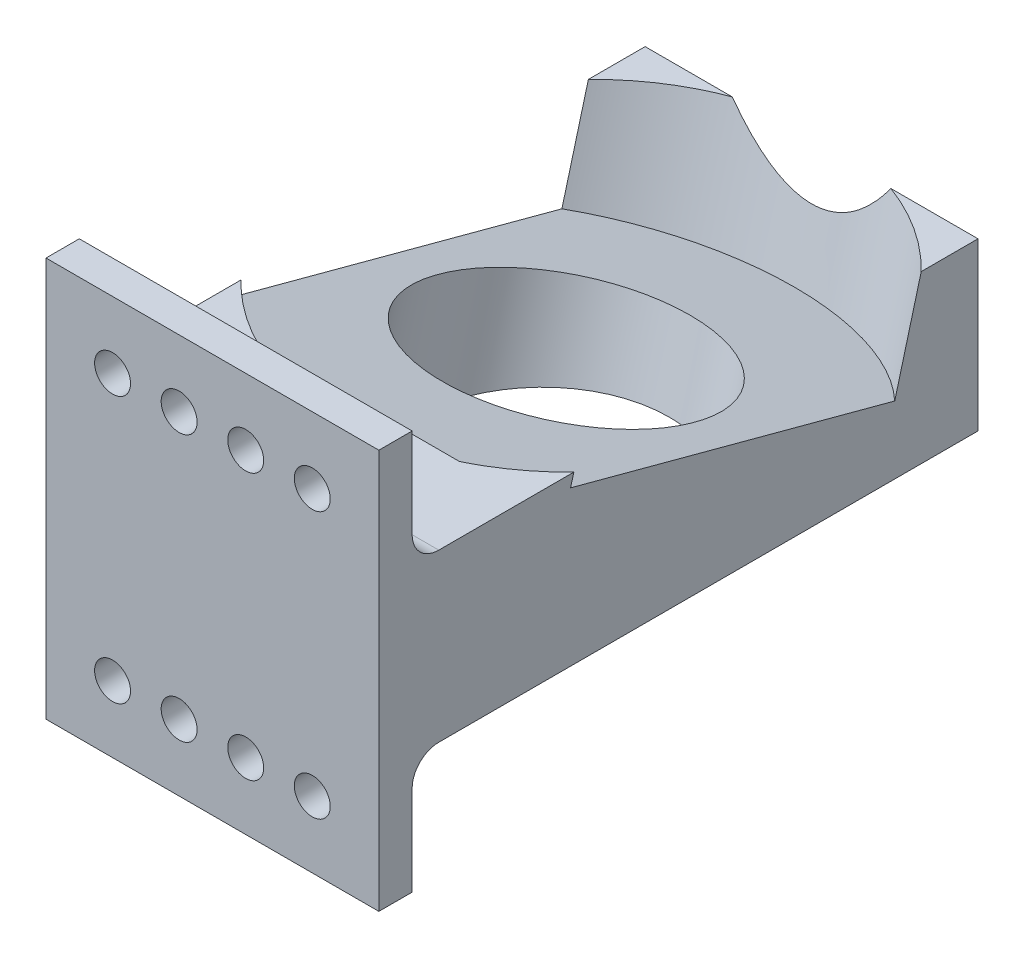
ISO-10303-21;
HEADER;
FILE_DESCRIPTION(('STEP AP214'),'2;1');
FILE_NAME('part.step','',(''),(''),'','','');
FILE_SCHEMA(('AUTOMOTIVE_DESIGN { 1 0 10303 214 1 1 1 1 }'));
ENDSEC;
DATA;
#1=APPLICATION_CONTEXT('core data for automotive mechanical design processes');
#2=APPLICATION_PROTOCOL_DEFINITION('international standard','automotive_design',2000,#1);
#3=PRODUCT_CONTEXT('',#1,'mechanical');
#4=PRODUCT('Part','Part','',(#3));
#5=PRODUCT_RELATED_PRODUCT_CATEGORY('part','',(#4));
#6=PRODUCT_DEFINITION_FORMATION('','',#4);
#7=PRODUCT_DEFINITION_CONTEXT('part definition',#1,'design');
#8=PRODUCT_DEFINITION('design','',#6,#7);
#9=PRODUCT_DEFINITION_SHAPE('','',#8);
#10=(LENGTH_UNIT() NAMED_UNIT(*) SI_UNIT(.MILLI.,.METRE.));
#11=(NAMED_UNIT(*) PLANE_ANGLE_UNIT() SI_UNIT($,.RADIAN.));
#12=(NAMED_UNIT(*) SI_UNIT($,.STERADIAN.) SOLID_ANGLE_UNIT());
#13=UNCERTAINTY_MEASURE_WITH_UNIT(LENGTH_MEASURE(1.E-05),#10,'distance_accuracy_value','');
#14=(GEOMETRIC_REPRESENTATION_CONTEXT(3) GLOBAL_UNCERTAINTY_ASSIGNED_CONTEXT((#13)) GLOBAL_UNIT_ASSIGNED_CONTEXT((#10,
#11,#12)) REPRESENTATION_CONTEXT('',''));
#15=CARTESIAN_POINT('',(0.,0.,0.));
#16=DIRECTION('',(0.,0.,1.));
#17=DIRECTION('',(1.,0.,0.));
#18=AXIS2_PLACEMENT_3D('',#15,#16,#17);
#19=CARTESIAN_POINT('',(31.75,15.875,-53.975));
#20=DIRECTION('',(0.,-1.,0.));
#21=DIRECTION('',(0.,0.,-1.));
#22=AXIS2_PLACEMENT_3D('',#19,#20,#21);
#23=PLANE('',#22);
#24=DIRECTION('',(0.,0.,1.));
#25=VECTOR('',#24,1.);
#26=CARTESIAN_POINT('',(-31.75,15.875,-53.975));
#27=LINE('',#26,#25);
#28=CARTESIAN_POINT('',(-31.75,15.875,-53.975));
#29=VERTEX_POINT('',#28);
#30=CARTESIAN_POINT('',(-31.75,15.875,-43.143798365032));
#31=VERTEX_POINT('',#30);
#32=EDGE_CURVE('E221',#29,#31,#27,.T.);
#33=ORIENTED_EDGE('',*,*,#32,.T.);
#34=CARTESIAN_POINT('',(0.,15.875,-10.0053416035631));
#35=DIRECTION('',(0.,-1.,0.));
#36=DIRECTION('',(0.,0.,1.));
#37=AXIS2_PLACEMENT_3D('',#34,#35,#36);
#38=ELLIPSE('',#37,46.6754265937885,45.085);
#39=CARTESIAN_POINT('',(-15.12729242551,15.875,-53.975));
#40=VERTEX_POINT('',#39);
#41=EDGE_CURVE('E206',#31,#40,#38,.T.);
#42=ORIENTED_EDGE('',*,*,#41,.T.);
#43=DIRECTION('',(-1.,0.,0.));
#44=VECTOR('',#43,1.);
#45=CARTESIAN_POINT('',(31.75,15.875,-53.975));
#46=LINE('',#45,#44);
#47=EDGE_CURVE('E226',#40,#29,#46,.T.);
#48=ORIENTED_EDGE('',*,*,#47,.T.);
#49=EDGE_LOOP('',(#33,#42,#48));
#50=FACE_BOUND('',#49,.T.);
#51=ADVANCED_FACE('F45',(#50),#23,.F.);
#52=CARTESIAN_POINT('',(31.75,15.875,-53.975));
#53=VERTEX_POINT('',#52);
#54=CARTESIAN_POINT('',(15.12729242551,15.875,-53.975));
#55=VERTEX_POINT('',#54);
#56=EDGE_CURVE('E236',#53,#55,#46,.T.);
#57=ORIENTED_EDGE('',*,*,#56,.T.);
#58=CARTESIAN_POINT('',(31.75,15.875,-43.143798365032));
#59=VERTEX_POINT('',#58);
#60=EDGE_CURVE('E211',#55,#59,#38,.T.);
#61=ORIENTED_EDGE('',*,*,#60,.T.);
#62=DIRECTION('',(0.,0.,1.));
#63=VECTOR('',#62,1.);
#64=CARTESIAN_POINT('',(31.75,15.875,-53.975));
#65=LINE('',#64,#63);
#66=EDGE_CURVE('E224',#53,#59,#65,.T.);
#67=ORIENTED_EDGE('',*,*,#66,.F.);
#68=EDGE_LOOP('',(#57,#61,#67));
#69=FACE_BOUND('',#68,.T.);
#70=ADVANCED_FACE('F314',(#69),#23,.F.);
#71=CARTESIAN_POINT('',(31.75,-15.875,-53.975));
#72=DIRECTION('',(0.,1.,0.));
#73=DIRECTION('',(0.,0.,1.));
#74=AXIS2_PLACEMENT_3D('',#71,#72,#73);
#75=PLANE('',#74);
#76=CARTESIAN_POINT('',(0.,-15.875,-1.49795474387514));
#77=DIRECTION('',(0.,1.,0.));
#78=DIRECTION('',(0.,0.,1.));
#79=AXIS2_PLACEMENT_3D('',#76,#77,#78);
#80=ELLIPSE('',#79,25.3099144205755,24.4475);
#81=CARTESIAN_POINT('',(0.,-15.875,23.8119596767003));
#82=VERTEX_POINT('',#81);
#83=EDGE_CURVE('E230',#82,#82,#80,.T.);
#84=ORIENTED_EDGE('',*,*,#83,.T.);
#85=EDGE_LOOP('',(#84));
#86=FACE_BOUND('',#85,.T.);
#87=DIRECTION('',(0.,0.,-1.));
#88=VECTOR('',#87,1.);
#89=CARTESIAN_POINT('',(31.75,-15.875,-53.975));
#90=LINE('',#89,#88);
#91=CARTESIAN_POINT('',(31.75,-15.875,48.895));
#92=VERTEX_POINT('',#91);
#93=CARTESIAN_POINT('',(31.75,-15.875,-53.975));
#94=VERTEX_POINT('',#93);
#95=EDGE_CURVE('E218',#92,#94,#90,.T.);
#96=ORIENTED_EDGE('',*,*,#95,.F.);
#97=DIRECTION('',(-1.,0.,0.));
#98=VECTOR('',#97,1.);
#99=CARTESIAN_POINT('',(31.75,-15.875,48.895));
#100=LINE('',#99,#98);
#101=CARTESIAN_POINT('',(-31.75,-15.875,48.895));
#102=VERTEX_POINT('',#101);
#103=EDGE_CURVE('E256',#92,#102,#100,.T.);
#104=ORIENTED_EDGE('',*,*,#103,.T.);
#105=DIRECTION('',(0.,0.,-1.));
#106=VECTOR('',#105,1.);
#107=CARTESIAN_POINT('',(-31.75,-15.875,-53.975));
#108=LINE('',#107,#106);
#109=CARTESIAN_POINT('',(-31.75,-15.875,-53.975));
#110=VERTEX_POINT('',#109);
#111=EDGE_CURVE('E227',#102,#110,#108,.T.);
#112=ORIENTED_EDGE('',*,*,#111,.T.);
#113=DIRECTION('',(-1.,0.,0.));
#114=VECTOR('',#113,1.);
#115=CARTESIAN_POINT('',(31.75,-15.875,-53.975));
#116=LINE('',#115,#114);
#117=EDGE_CURVE('E239',#94,#110,#116,.T.);
#118=ORIENTED_EDGE('',*,*,#117,.F.);
#119=EDGE_LOOP('',(#96,#104,#112,#118));
#120=FACE_BOUND('',#119,.T.);
#121=ADVANCED_FACE('F316',(#86,#120),#75,.F.);
#122=CARTESIAN_POINT('',(31.75,15.875,-53.975));
#123=DIRECTION('',(0.,0.,1.));
#124=DIRECTION('',(0.,-1.,0.));
#125=AXIS2_PLACEMENT_3D('',#122,#123,#124);
#126=PLANE('',#125);
#127=ORIENTED_EDGE('',*,*,#47,.F.);
#128=CARTESIAN_POINT('',(0.,179.971999126954,-53.9749999999999));
#129=DIRECTION('',(0.,0.,1.));
#130=DIRECTION('',(0.,-1.,0.));
#131=AXIS2_PLACEMENT_3D('',#128,#129,#130);
#132=ELLIPSE('',#131,174.195063512975,45.085);
#133=EDGE_CURVE('E208',#40,#55,#132,.T.);
#134=ORIENTED_EDGE('',*,*,#133,.T.);
#135=ORIENTED_EDGE('',*,*,#56,.F.);
#136=DIRECTION('',(0.,1.,0.));
#137=VECTOR('',#136,1.);
#138=CARTESIAN_POINT('',(31.75,15.875,-53.975));
#139=LINE('',#138,#137);
#140=EDGE_CURVE('E220',#94,#53,#139,.T.);
#141=ORIENTED_EDGE('',*,*,#140,.F.);
#142=ORIENTED_EDGE('',*,*,#117,.T.);
#143=DIRECTION('',(0.,1.,0.));
#144=VECTOR('',#143,1.);
#145=CARTESIAN_POINT('',(-31.75,15.875,-53.975));
#146=LINE('',#145,#144);
#147=EDGE_CURVE('E229',#110,#29,#146,.T.);
#148=ORIENTED_EDGE('',*,*,#147,.T.);
#149=EDGE_LOOP('',(#127,#134,#135,#141,#142,#148));
#150=FACE_BOUND('',#149,.T.);
#151=ADVANCED_FACE('F308',(#150),#126,.F.);
#152=CARTESIAN_POINT('',(-31.75,15.875,23.1331151579059));
#153=VERTEX_POINT('',#152);
#154=CARTESIAN_POINT('',(-31.75,15.875,48.895));
#155=VERTEX_POINT('',#154);
#156=EDGE_CURVE('E233',#153,#155,#27,.T.);
#157=ORIENTED_EDGE('',*,*,#156,.T.);
#158=DIRECTION('',(-1.,0.,0.));
#159=VECTOR('',#158,1.);
#160=CARTESIAN_POINT('',(31.75,15.875,48.895));
#161=LINE('',#160,#159);
#162=CARTESIAN_POINT('',(31.75,15.875,48.895));
#163=VERTEX_POINT('',#162);
#164=EDGE_CURVE('E254',#155,#163,#161,.F.);
#165=ORIENTED_EDGE('',*,*,#164,.T.);
#166=CARTESIAN_POINT('',(31.75,15.875,23.1331151579059));
#167=VERTEX_POINT('',#166);
#168=EDGE_CURVE('E223',#167,#163,#65,.T.);
#169=ORIENTED_EDGE('',*,*,#168,.F.);
#170=CARTESIAN_POINT('',(19.0851798134345,15.875,32.2817700293526));
#171=VERTEX_POINT('',#170);
#172=EDGE_CURVE('E207',#167,#171,#38,.T.);
#173=ORIENTED_EDGE('',*,*,#172,.T.);
#174=DIRECTION('',(-1.,0.,0.));
#175=VECTOR('',#174,1.);
#176=CARTESIAN_POINT('',(31.75,15.875,32.2817700293526));
#177=LINE('',#176,#175);
#178=CARTESIAN_POINT('',(-19.0851798134345,15.875,32.2817700293526));
#179=VERTEX_POINT('',#178);
#180=EDGE_CURVE('E200',#171,#179,#177,.T.);
#181=ORIENTED_EDGE('',*,*,#180,.T.);
#182=EDGE_CURVE('E203',#179,#153,#38,.T.);
#183=ORIENTED_EDGE('',*,*,#182,.T.);
#184=EDGE_LOOP('',(#157,#165,#169,#173,#181,#183));
#185=FACE_BOUND('',#184,.T.);
#186=ADVANCED_FACE('F286',(#185),#23,.F.);
#187=CARTESIAN_POINT('',(31.75,0.,0.));
#188=DIRECTION('',(-1.,0.,0.));
#189=DIRECTION('',(0.,0.,1.));
#190=AXIS2_PLACEMENT_3D('',#187,#188,#189);
#191=PLANE('',#190);
#192=ORIENTED_EDGE('',*,*,#66,.T.);
#193=DIRECTION('',(0.,-0.96592582628907,0.258819045102514));
#194=VECTOR('',#193,1.);
#195=CARTESIAN_POINT('',(31.75,-29.750057401948,-30.9186010795568));
#196=LINE('',#195,#194);
#197=CARTESIAN_POINT('',(31.75,-2.98139209859573,-38.0912433300489));
#198=VERTEX_POINT('',#197);
#199=EDGE_CURVE('E212',#59,#198,#196,.T.);
#200=ORIENTED_EDGE('',*,*,#199,.T.);
#201=DIRECTION('',(0.,0.258819045102514,0.96592582628907));
#202=VECTOR('',#201,1.);
#203=CARTESIAN_POINT('',(31.75,6.74113413520106,-1.80628144759695));
#204=LINE('',#203,#202);
#205=CARTESIAN_POINT('',(31.75,13.5878362821384,23.7459588290647));
#206=VERTEX_POINT('',#205);
#207=EDGE_CURVE('E197',#198,#206,#204,.T.);
#208=ORIENTED_EDGE('',*,*,#207,.T.);
#209=DIRECTION('',(0.,-0.96592582628907,0.258819045102514));
#210=VECTOR('',#209,1.);
#211=CARTESIAN_POINT('',(31.75,-13.1808290212139,30.9186010795567));
#212=LINE('',#211,#210);
#213=EDGE_CURVE('E215',#206,#167,#212,.F.);
#214=ORIENTED_EDGE('',*,*,#213,.T.);
#215=ORIENTED_EDGE('',*,*,#168,.T.);
#216=CARTESIAN_POINT('',(31.75,20.955,48.895));
#217=DIRECTION('',(-1.,0.,0.));
#218=DIRECTION('',(0.,0.,1.));
#219=AXIS2_PLACEMENT_3D('',#216,#217,#218);
#220=CIRCLE('',#219,5.08);
#221=CARTESIAN_POINT('',(31.75,20.955,53.975));
#222=VERTEX_POINT('',#221);
#223=EDGE_CURVE('E262',#163,#222,#220,.T.);
#224=ORIENTED_EDGE('',*,*,#223,.T.);
#225=DIRECTION('',(0.,1.,0.));
#226=VECTOR('',#225,1.);
#227=CARTESIAN_POINT('',(31.75,-38.1,53.975));
#228=LINE('',#227,#226);
#229=CARTESIAN_POINT('',(31.75,38.1,53.975));
#230=VERTEX_POINT('',#229);
#231=EDGE_CURVE('E182',#222,#230,#228,.T.);
#232=ORIENTED_EDGE('',*,*,#231,.T.);
#233=DIRECTION('',(0.,0.,-1.));
#234=VECTOR('',#233,1.);
#235=CARTESIAN_POINT('',(31.75,38.1,60.325));
#236=LINE('',#235,#234);
#237=CARTESIAN_POINT('',(31.75,38.1,60.325));
#238=VERTEX_POINT('',#237);
#239=EDGE_CURVE('E161',#238,#230,#236,.T.);
#240=ORIENTED_EDGE('',*,*,#239,.F.);
#241=DIRECTION('',(0.,1.,0.));
#242=VECTOR('',#241,1.);
#243=CARTESIAN_POINT('',(31.75,-38.1,60.325));
#244=LINE('',#243,#242);
#245=CARTESIAN_POINT('',(31.75,-38.1,60.325));
#246=VERTEX_POINT('',#245);
#247=EDGE_CURVE('E167',#246,#238,#244,.T.);
#248=ORIENTED_EDGE('',*,*,#247,.F.);
#249=DIRECTION('',(0.,0.,-1.));
#250=VECTOR('',#249,1.);
#251=CARTESIAN_POINT('',(31.75,-38.1,60.325));
#252=LINE('',#251,#250);
#253=CARTESIAN_POINT('',(31.75,-38.1,53.975));
#254=VERTEX_POINT('',#253);
#255=EDGE_CURVE('E583',#246,#254,#252,.T.);
#256=ORIENTED_EDGE('',*,*,#255,.T.);
#257=CARTESIAN_POINT('',(31.75,-20.955,53.975));
#258=VERTEX_POINT('',#257);
#259=EDGE_CURVE('E275',#254,#258,#228,.T.);
#260=ORIENTED_EDGE('',*,*,#259,.T.);
#261=CARTESIAN_POINT('',(31.75,-20.955,48.895));
#262=DIRECTION('',(-1.,0.,0.));
#263=DIRECTION('',(0.,0.,1.));
#264=AXIS2_PLACEMENT_3D('',#261,#262,#263);
#265=CIRCLE('',#264,5.08);
#266=EDGE_CURVE('E13',#258,#92,#265,.T.);
#267=ORIENTED_EDGE('',*,*,#266,.T.);
#268=ORIENTED_EDGE('',*,*,#95,.T.);
#269=ORIENTED_EDGE('',*,*,#140,.T.);
#270=EDGE_LOOP('',(#192,#200,#208,#214,#215,#224,#232,#240,#248,#256,#260,#267,#268,#269));
#271=FACE_BOUND('',#270,.T.);
#272=ADVANCED_FACE('F180',(#271),#191,.F.);
#273=CARTESIAN_POINT('',(-31.75,0.,0.));
#274=DIRECTION('',(-1.,0.,0.));
#275=DIRECTION('',(0.,0.,1.));
#276=AXIS2_PLACEMENT_3D('',#273,#274,#275);
#277=PLANE('',#276);
#278=DIRECTION('',(0.,-0.96592582628907,0.258819045102514));
#279=VECTOR('',#278,1.);
#280=CARTESIAN_POINT('',(-31.75,-29.750057401948,-30.9186010795568));
#281=LINE('',#280,#279);
#282=CARTESIAN_POINT('',(-31.75,-2.98139209859573,-38.0912433300489));
#283=VERTEX_POINT('',#282);
#284=EDGE_CURVE('E246',#31,#283,#281,.T.);
#285=ORIENTED_EDGE('',*,*,#284,.F.);
#286=ORIENTED_EDGE('',*,*,#32,.F.);
#287=ORIENTED_EDGE('',*,*,#147,.F.);
#288=ORIENTED_EDGE('',*,*,#111,.F.);
#289=CARTESIAN_POINT('',(-31.75,-20.955,48.895));
#290=DIRECTION('',(-1.,0.,0.));
#291=DIRECTION('',(0.,0.,1.));
#292=AXIS2_PLACEMENT_3D('',#289,#290,#291);
#293=CIRCLE('',#292,5.08);
#294=CARTESIAN_POINT('',(-31.75,-20.955,53.975));
#295=VERTEX_POINT('',#294);
#296=EDGE_CURVE('E53',#102,#295,#293,.F.);
#297=ORIENTED_EDGE('',*,*,#296,.T.);
#298=DIRECTION('',(0.,-1.,0.));
#299=VECTOR('',#298,1.);
#300=CARTESIAN_POINT('',(-31.75,-38.1,53.975));
#301=LINE('',#300,#299);
#302=CARTESIAN_POINT('',(-31.75,-38.1,53.975));
#303=VERTEX_POINT('',#302);
#304=EDGE_CURVE('E575',#295,#303,#301,.T.);
#305=ORIENTED_EDGE('',*,*,#304,.T.);
#306=DIRECTION('',(0.,0.,-1.));
#307=VECTOR('',#306,1.);
#308=CARTESIAN_POINT('',(-31.75,-38.1,60.325));
#309=LINE('',#308,#307);
#310=CARTESIAN_POINT('',(-31.75,-38.1,60.325));
#311=VERTEX_POINT('',#310);
#312=EDGE_CURVE('E189',#311,#303,#309,.T.);
#313=ORIENTED_EDGE('',*,*,#312,.F.);
#314=DIRECTION('',(0.,-1.,0.));
#315=VECTOR('',#314,1.);
#316=CARTESIAN_POINT('',(-31.75,-38.1,60.325));
#317=LINE('',#316,#315);
#318=CARTESIAN_POINT('',(-31.75,38.1,60.325));
#319=VERTEX_POINT('',#318);
#320=EDGE_CURVE('E166',#319,#311,#317,.T.);
#321=ORIENTED_EDGE('',*,*,#320,.F.);
#322=DIRECTION('',(0.,0.,-1.));
#323=VECTOR('',#322,1.);
#324=CARTESIAN_POINT('',(-31.75,38.1,60.325));
#325=LINE('',#324,#323);
#326=CARTESIAN_POINT('',(-31.75,38.1,53.975));
#327=VERTEX_POINT('',#326);
#328=EDGE_CURVE('E163',#319,#327,#325,.T.);
#329=ORIENTED_EDGE('',*,*,#328,.T.);
#330=CARTESIAN_POINT('',(-31.75,20.955,53.975));
#331=VERTEX_POINT('',#330);
#332=EDGE_CURVE('E284',#327,#331,#301,.T.);
#333=ORIENTED_EDGE('',*,*,#332,.T.);
#334=CARTESIAN_POINT('',(-31.75,20.955,48.895));
#335=DIRECTION('',(-1.,0.,0.));
#336=DIRECTION('',(0.,0.,1.));
#337=AXIS2_PLACEMENT_3D('',#334,#335,#336);
#338=CIRCLE('',#337,5.08);
#339=EDGE_CURVE('E260',#331,#155,#338,.F.);
#340=ORIENTED_EDGE('',*,*,#339,.T.);
#341=ORIENTED_EDGE('',*,*,#156,.F.);
#342=DIRECTION('',(0.,-0.96592582628907,0.258819045102514));
#343=VECTOR('',#342,1.);
#344=CARTESIAN_POINT('',(-31.75,-13.1808290212139,30.9186010795567));
#345=LINE('',#344,#343);
#346=CARTESIAN_POINT('',(-31.75,13.5878362821384,23.7459588290647));
#347=VERTEX_POINT('',#346);
#348=EDGE_CURVE('E244',#347,#153,#345,.F.);
#349=ORIENTED_EDGE('',*,*,#348,.F.);
#350=DIRECTION('',(0.,0.258819045102514,0.96592582628907));
#351=VECTOR('',#350,1.);
#352=CARTESIAN_POINT('',(-31.75,6.74113413520106,-1.80628144759695));
#353=LINE('',#352,#351);
#354=EDGE_CURVE('E242',#283,#347,#353,.T.);
#355=ORIENTED_EDGE('',*,*,#354,.F.);
#356=EDGE_LOOP('',(#285,#286,#287,#288,#297,#305,#313,#321,#329,#333,#340,#341,#349,#355));
#357=FACE_BOUND('',#356,.T.);
#358=ADVANCED_FACE('F282',(#357),#277,.T.);
#359=CARTESIAN_POINT('',(0.,-21.465443211581,0.));
#360=DIRECTION('',(0.,-0.96592582628907,0.258819045102514));
#361=DIRECTION('',(0.,-0.258819045102514,-0.96592582628907));
#362=AXIS2_PLACEMENT_3D('',#359,#360,#361);
#363=CYLINDRICAL_SURFACE('',#362,24.4475);
#364=CARTESIAN_POINT('',(0.,5.30322209177131,-7.17264225049207));
#365=DIRECTION('',(0.,-0.96592582628907,0.258819045102514));
#366=DIRECTION('',(0.,-0.258819045102514,-0.96592582628907));
#367=AXIS2_PLACEMENT_3D('',#364,#365,#366);
#368=CIRCLE('',#367,24.4475);
#369=CARTESIAN_POINT('',(0.,-1.0242565133724,-30.7871138886941));
#370=VERTEX_POINT('',#369);
#371=EDGE_CURVE('E184',#370,#370,#368,.T.);
#372=ORIENTED_EDGE('',*,*,#371,.F.);
#373=EDGE_LOOP('',(#372));
#374=FACE_BOUND('',#373,.T.);
#375=ORIENTED_EDGE('',*,*,#83,.F.);
#376=EDGE_LOOP('',(#375));
#377=FACE_BOUND('',#376,.T.);
#378=ADVANCED_FACE('F388',(#374,#377),#363,.F.);
#379=CARTESIAN_POINT('',(0.,-21.465443211581,0.));
#380=DIRECTION('',(0.,-0.96592582628907,0.258819045102514));
#381=DIRECTION('',(0.,-0.258819045102514,-0.96592582628907));
#382=AXIS2_PLACEMENT_3D('',#379,#380,#381);
#383=CYLINDRICAL_SURFACE('',#382,45.085);
#384=ORIENTED_EDGE('',*,*,#213,.F.);
#385=CARTESIAN_POINT('',(0.,5.30322209177132,-7.17264225049208));
#386=DIRECTION('',(0.,-0.96592582628907,0.258819045102514));
#387=DIRECTION('',(0.,-0.258819045102514,-0.96592582628907));
#388=AXIS2_PLACEMENT_3D('',#385,#386,#387);
#389=CIRCLE('',#388,45.085);
#390=EDGE_CURVE('E196',#206,#171,#389,.T.);
#391=ORIENTED_EDGE('',*,*,#390,.T.);
#392=ORIENTED_EDGE('',*,*,#172,.F.);
#393=EDGE_LOOP('',(#384,#391,#392));
#394=FACE_BOUND('',#393,.T.);
#395=ADVANCED_FACE('F298',(#394),#383,.F.);
#396=ORIENTED_EDGE('',*,*,#60,.F.);
#397=ORIENTED_EDGE('',*,*,#133,.F.);
#398=ORIENTED_EDGE('',*,*,#41,.F.);
#399=ORIENTED_EDGE('',*,*,#284,.T.);
#400=EDGE_CURVE('E187',#283,#198,#389,.T.);
#401=ORIENTED_EDGE('',*,*,#400,.T.);
#402=ORIENTED_EDGE('',*,*,#199,.F.);
#403=EDGE_LOOP('',(#396,#397,#398,#399,#401,#402));
#404=FACE_BOUND('',#403,.T.);
#405=ADVANCED_FACE('F313',(#404),#383,.F.);
#406=EDGE_CURVE('E195',#179,#347,#389,.T.);
#407=ORIENTED_EDGE('',*,*,#406,.T.);
#408=ORIENTED_EDGE('',*,*,#348,.T.);
#409=ORIENTED_EDGE('',*,*,#182,.F.);
#410=EDGE_LOOP('',(#407,#408,#409));
#411=FACE_BOUND('',#410,.T.);
#412=ADVANCED_FACE('F291',(#411),#383,.F.);
#413=CARTESIAN_POINT('',(0.,-1.0242565133724,-30.7871138886941));
#414=DIRECTION('',(0.,-0.96592582628907,0.258819045102514));
#415=DIRECTION('',(0.,-0.258819045102514,-0.96592582628907));
#416=AXIS2_PLACEMENT_3D('',#413,#414,#415);
#417=PLANE('',#416);
#418=ORIENTED_EDGE('',*,*,#371,.T.);
#419=EDGE_LOOP('',(#418));
#420=FACE_BOUND('',#419,.T.);
#421=ORIENTED_EDGE('',*,*,#390,.F.);
#422=ORIENTED_EDGE('',*,*,#207,.F.);
#423=ORIENTED_EDGE('',*,*,#400,.F.);
#424=ORIENTED_EDGE('',*,*,#354,.T.);
#425=ORIENTED_EDGE('',*,*,#406,.F.);
#426=ORIENTED_EDGE('',*,*,#180,.F.);
#427=EDGE_LOOP('',(#421,#422,#423,#424,#425,#426));
#428=FACE_BOUND('',#427,.T.);
#429=ADVANCED_FACE('F294',(#420,#428),#417,.F.);
#430=CARTESIAN_POINT('',(0.,0.,53.975));
#431=DIRECTION('',(0.,0.,-1.));
#432=DIRECTION('',(-1.,0.,0.));
#433=AXIS2_PLACEMENT_3D('',#430,#431,#432);
#434=PLANE('',#433);
#435=CARTESIAN_POINT('',(19.0500000000005,-25.4,53.975));
#436=DIRECTION('',(0.,0.,1.));
#437=DIRECTION('',(1.,0.,0.));
#438=AXIS2_PLACEMENT_3D('',#435,#436,#437);
#439=CIRCLE('',#438,3.429);
#440=CARTESIAN_POINT('',(22.4790000000005,-25.4,53.975));
#441=VERTEX_POINT('',#440);
#442=EDGE_CURVE('E562',#441,#441,#439,.T.);
#443=ORIENTED_EDGE('',*,*,#442,.T.);
#444=EDGE_LOOP('',(#443));
#445=FACE_BOUND('',#444,.T.);
#446=CARTESIAN_POINT('',(-6.34999999999948,-25.4,53.975));
#447=DIRECTION('',(0.,0.,1.));
#448=DIRECTION('',(1.,0.,0.));
#449=AXIS2_PLACEMENT_3D('',#446,#447,#448);
#450=CIRCLE('',#449,3.429);
#451=CARTESIAN_POINT('',(-2.92099999999948,-25.4,53.975));
#452=VERTEX_POINT('',#451);
#453=EDGE_CURVE('E566',#452,#452,#450,.T.);
#454=ORIENTED_EDGE('',*,*,#453,.T.);
#455=EDGE_LOOP('',(#454));
#456=FACE_BOUND('',#455,.T.);
#457=CARTESIAN_POINT('',(6.35000000000052,-25.4,53.975));
#458=DIRECTION('',(0.,0.,1.));
#459=DIRECTION('',(1.,0.,0.));
#460=AXIS2_PLACEMENT_3D('',#457,#458,#459);
#461=CIRCLE('',#460,3.429);
#462=CARTESIAN_POINT('',(9.77900000000052,-25.4,53.975));
#463=VERTEX_POINT('',#462);
#464=EDGE_CURVE('E570',#463,#463,#461,.T.);
#465=ORIENTED_EDGE('',*,*,#464,.T.);
#466=EDGE_LOOP('',(#465));
#467=FACE_BOUND('',#466,.T.);
#468=CARTESIAN_POINT('',(-19.0499999999995,-25.4,53.975));
#469=DIRECTION('',(0.,0.,1.));
#470=DIRECTION('',(1.,0.,0.));
#471=AXIS2_PLACEMENT_3D('',#468,#469,#470);
#472=CIRCLE('',#471,3.429);
#473=CARTESIAN_POINT('',(-15.6209999999995,-25.4,53.975));
#474=VERTEX_POINT('',#473);
#475=EDGE_CURVE('E573',#474,#474,#472,.T.);
#476=ORIENTED_EDGE('',*,*,#475,.T.);
#477=EDGE_LOOP('',(#476));
#478=FACE_BOUND('',#477,.T.);
#479=ORIENTED_EDGE('',*,*,#304,.F.);
#480=DIRECTION('',(-1.,0.,0.));
#481=VECTOR('',#480,1.);
#482=CARTESIAN_POINT('',(0.,-20.955,53.975));
#483=LINE('',#482,#481);
#484=EDGE_CURVE('E66',#295,#258,#483,.F.);
#485=ORIENTED_EDGE('',*,*,#484,.T.);
#486=ORIENTED_EDGE('',*,*,#259,.F.);
#487=DIRECTION('',(1.,0.,0.));
#488=VECTOR('',#487,1.);
#489=CARTESIAN_POINT('',(-31.75,-38.1,53.975));
#490=LINE('',#489,#488);
#491=EDGE_CURVE('E177',#303,#254,#490,.T.);
#492=ORIENTED_EDGE('',*,*,#491,.F.);
#493=EDGE_LOOP('',(#479,#485,#486,#492));
#494=FACE_BOUND('',#493,.T.);
#495=ADVANCED_FACE('F379',(#445,#456,#467,#478,#494),#434,.T.);
#496=CARTESIAN_POINT('',(0.,0.,60.325));
#497=DIRECTION('',(0.,0.,-1.));
#498=DIRECTION('',(-1.,0.,0.));
#499=AXIS2_PLACEMENT_3D('',#496,#497,#498);
#500=PLANE('',#499);
#501=ORIENTED_EDGE('',*,*,#247,.T.);
#502=DIRECTION('',(-1.,0.,0.));
#503=VECTOR('',#502,1.);
#504=CARTESIAN_POINT('',(-31.75,38.1,60.325));
#505=LINE('',#504,#503);
#506=EDGE_CURVE('E157',#238,#319,#505,.T.);
#507=ORIENTED_EDGE('',*,*,#506,.T.);
#508=ORIENTED_EDGE('',*,*,#320,.T.);
#509=DIRECTION('',(1.,0.,0.));
#510=VECTOR('',#509,1.);
#511=CARTESIAN_POINT('',(-31.75,-38.1,60.325));
#512=LINE('',#511,#510);
#513=EDGE_CURVE('E173',#311,#246,#512,.T.);
#514=ORIENTED_EDGE('',*,*,#513,.T.);
#515=EDGE_LOOP('',(#501,#507,#508,#514));
#516=FACE_BOUND('',#515,.T.);
#517=CARTESIAN_POINT('',(-19.05,25.4,60.325));
#518=DIRECTION('',(0.,0.,1.));
#519=DIRECTION('',(1.,0.,0.));
#520=AXIS2_PLACEMENT_3D('',#517,#518,#519);
#521=CIRCLE('',#520,3.429);
#522=CARTESIAN_POINT('',(-15.621,25.4,60.325));
#523=VERTEX_POINT('',#522);
#524=EDGE_CURVE('E276',#523,#523,#521,.T.);
#525=ORIENTED_EDGE('',*,*,#524,.F.);
#526=EDGE_LOOP('',(#525));
#527=FACE_BOUND('',#526,.T.);
#528=CARTESIAN_POINT('',(-6.35000000000001,25.4,60.325));
#529=DIRECTION('',(0.,0.,1.));
#530=DIRECTION('',(1.,0.,0.));
#531=AXIS2_PLACEMENT_3D('',#528,#529,#530);
#532=CIRCLE('',#531,3.429);
#533=CARTESIAN_POINT('',(-2.92100000000001,25.4,60.325));
#534=VERTEX_POINT('',#533);
#535=EDGE_CURVE('E593',#534,#534,#532,.T.);
#536=ORIENTED_EDGE('',*,*,#535,.F.);
#537=EDGE_LOOP('',(#536));
#538=FACE_BOUND('',#537,.T.);
#539=CARTESIAN_POINT('',(6.34999999999999,25.4,60.325));
#540=DIRECTION('',(0.,0.,1.));
#541=DIRECTION('',(1.,0.,0.));
#542=AXIS2_PLACEMENT_3D('',#539,#540,#541);
#543=CIRCLE('',#542,3.429);
#544=CARTESIAN_POINT('',(9.77899999999999,25.4,60.325));
#545=VERTEX_POINT('',#544);
#546=EDGE_CURVE('E599',#545,#545,#543,.T.);
#547=ORIENTED_EDGE('',*,*,#546,.F.);
#548=EDGE_LOOP('',(#547));
#549=FACE_BOUND('',#548,.T.);
#550=CARTESIAN_POINT('',(19.05,25.4,60.325));
#551=DIRECTION('',(0.,0.,1.));
#552=DIRECTION('',(1.,0.,0.));
#553=AXIS2_PLACEMENT_3D('',#550,#551,#552);
#554=CIRCLE('',#553,3.429);
#555=CARTESIAN_POINT('',(22.479,25.4,60.325));
#556=VERTEX_POINT('',#555);
#557=EDGE_CURVE('E605',#556,#556,#554,.T.);
#558=ORIENTED_EDGE('',*,*,#557,.F.);
#559=EDGE_LOOP('',(#558));
#560=FACE_BOUND('',#559,.T.);
#561=CARTESIAN_POINT('',(-6.34999999999948,-25.4,60.325));
#562=DIRECTION('',(0.,0.,1.));
#563=DIRECTION('',(1.,0.,0.));
#564=AXIS2_PLACEMENT_3D('',#561,#562,#563);
#565=CIRCLE('',#564,3.429);
#566=CARTESIAN_POINT('',(-2.92099999999948,-25.4,60.325));
#567=VERTEX_POINT('',#566);
#568=EDGE_CURVE('E611',#567,#567,#565,.T.);
#569=ORIENTED_EDGE('',*,*,#568,.F.);
#570=EDGE_LOOP('',(#569));
#571=FACE_BOUND('',#570,.T.);
#572=CARTESIAN_POINT('',(6.35000000000052,-25.4,60.325));
#573=DIRECTION('',(0.,0.,1.));
#574=DIRECTION('',(1.,0.,0.));
#575=AXIS2_PLACEMENT_3D('',#572,#573,#574);
#576=CIRCLE('',#575,3.429);
#577=CARTESIAN_POINT('',(9.77900000000052,-25.4,60.325));
#578=VERTEX_POINT('',#577);
#579=EDGE_CURVE('E615',#578,#578,#576,.T.);
#580=ORIENTED_EDGE('',*,*,#579,.F.);
#581=EDGE_LOOP('',(#580));
#582=FACE_BOUND('',#581,.T.);
#583=CARTESIAN_POINT('',(19.0500000000005,-25.4,60.325));
#584=DIRECTION('',(0.,0.,1.));
#585=DIRECTION('',(1.,0.,0.));
#586=AXIS2_PLACEMENT_3D('',#583,#584,#585);
#587=CIRCLE('',#586,3.429);
#588=CARTESIAN_POINT('',(22.4790000000005,-25.4,60.325));
#589=VERTEX_POINT('',#588);
#590=EDGE_CURVE('E619',#589,#589,#587,.T.);
#591=ORIENTED_EDGE('',*,*,#590,.F.);
#592=EDGE_LOOP('',(#591));
#593=FACE_BOUND('',#592,.T.);
#594=CARTESIAN_POINT('',(-19.0499999999995,-25.4,60.325));
#595=DIRECTION('',(0.,0.,1.));
#596=DIRECTION('',(1.,0.,0.));
#597=AXIS2_PLACEMENT_3D('',#594,#595,#596);
#598=CIRCLE('',#597,3.429);
#599=CARTESIAN_POINT('',(-15.6209999999995,-25.4,60.325));
#600=VERTEX_POINT('',#599);
#601=EDGE_CURVE('E623',#600,#600,#598,.T.);
#602=ORIENTED_EDGE('',*,*,#601,.F.);
#603=EDGE_LOOP('',(#602));
#604=FACE_BOUND('',#603,.T.);
#605=ADVANCED_FACE('F170',(#516,#527,#538,#549,#560,#571,#582,#593,#604),#500,.F.);
#606=CARTESIAN_POINT('',(6.34999999999999,25.4,53.975));
#607=DIRECTION('',(0.,0.,1.));
#608=DIRECTION('',(1.,0.,0.));
#609=AXIS2_PLACEMENT_3D('',#606,#607,#608);
#610=CIRCLE('',#609,3.429);
#611=CARTESIAN_POINT('',(9.77899999999999,25.4,53.975));
#612=VERTEX_POINT('',#611);
#613=EDGE_CURVE('E602',#612,#612,#610,.T.);
#614=ORIENTED_EDGE('',*,*,#613,.T.);
#615=EDGE_LOOP('',(#614));
#616=FACE_BOUND('',#615,.T.);
#617=CARTESIAN_POINT('',(-19.05,25.4,53.975));
#618=DIRECTION('',(0.,0.,1.));
#619=DIRECTION('',(1.,0.,0.));
#620=AXIS2_PLACEMENT_3D('',#617,#618,#619);
#621=CIRCLE('',#620,3.429);
#622=CARTESIAN_POINT('',(-15.621,25.4,53.975));
#623=VERTEX_POINT('',#622);
#624=EDGE_CURVE('E590',#623,#623,#621,.T.);
#625=ORIENTED_EDGE('',*,*,#624,.T.);
#626=EDGE_LOOP('',(#625));
#627=FACE_BOUND('',#626,.T.);
#628=ORIENTED_EDGE('',*,*,#231,.F.);
#629=DIRECTION('',(-1.,0.,0.));
#630=VECTOR('',#629,1.);
#631=CARTESIAN_POINT('',(0.,20.955,53.975));
#632=LINE('',#631,#630);
#633=EDGE_CURVE('E249',#222,#331,#632,.T.);
#634=ORIENTED_EDGE('',*,*,#633,.T.);
#635=ORIENTED_EDGE('',*,*,#332,.F.);
#636=DIRECTION('',(-1.,0.,0.));
#637=VECTOR('',#636,1.);
#638=CARTESIAN_POINT('',(-31.75,38.1,53.975));
#639=LINE('',#638,#637);
#640=EDGE_CURVE('E274',#230,#327,#639,.T.);
#641=ORIENTED_EDGE('',*,*,#640,.F.);
#642=EDGE_LOOP('',(#628,#634,#635,#641));
#643=FACE_BOUND('',#642,.T.);
#644=CARTESIAN_POINT('',(-6.35000000000001,25.4,53.975));
#645=DIRECTION('',(0.,0.,1.));
#646=DIRECTION('',(1.,0.,0.));
#647=AXIS2_PLACEMENT_3D('',#644,#645,#646);
#648=CIRCLE('',#647,3.429);
#649=CARTESIAN_POINT('',(-2.92100000000001,25.4,53.975));
#650=VERTEX_POINT('',#649);
#651=EDGE_CURVE('E596',#650,#650,#648,.T.);
#652=ORIENTED_EDGE('',*,*,#651,.T.);
#653=EDGE_LOOP('',(#652));
#654=FACE_BOUND('',#653,.T.);
#655=CARTESIAN_POINT('',(19.05,25.4,53.975));
#656=DIRECTION('',(0.,0.,1.));
#657=DIRECTION('',(1.,0.,0.));
#658=AXIS2_PLACEMENT_3D('',#655,#656,#657);
#659=CIRCLE('',#658,3.429);
#660=CARTESIAN_POINT('',(22.479,25.4,53.975));
#661=VERTEX_POINT('',#660);
#662=EDGE_CURVE('E608',#661,#661,#659,.T.);
#663=ORIENTED_EDGE('',*,*,#662,.T.);
#664=EDGE_LOOP('',(#663));
#665=FACE_BOUND('',#664,.T.);
#666=ADVANCED_FACE('F270',(#616,#627,#643,#654,#665),#434,.T.);
#667=CARTESIAN_POINT('',(-31.75,38.1,60.325));
#668=DIRECTION('',(0.,-1.,0.));
#669=DIRECTION('',(0.,0.,-1.));
#670=AXIS2_PLACEMENT_3D('',#667,#668,#669);
#671=PLANE('',#670);
#672=ORIENTED_EDGE('',*,*,#640,.T.);
#673=ORIENTED_EDGE('',*,*,#328,.F.);
#674=ORIENTED_EDGE('',*,*,#506,.F.);
#675=ORIENTED_EDGE('',*,*,#239,.T.);
#676=EDGE_LOOP('',(#672,#673,#674,#675));
#677=FACE_BOUND('',#676,.T.);
#678=ADVANCED_FACE('F159',(#677),#671,.F.);
#679=CARTESIAN_POINT('',(-31.75,-38.1,60.325));
#680=DIRECTION('',(0.,1.,0.));
#681=DIRECTION('',(0.,0.,1.));
#682=AXIS2_PLACEMENT_3D('',#679,#680,#681);
#683=PLANE('',#682);
#684=ORIENTED_EDGE('',*,*,#491,.T.);
#685=ORIENTED_EDGE('',*,*,#255,.F.);
#686=ORIENTED_EDGE('',*,*,#513,.F.);
#687=ORIENTED_EDGE('',*,*,#312,.T.);
#688=EDGE_LOOP('',(#684,#685,#686,#687));
#689=FACE_BOUND('',#688,.T.);
#690=ADVANCED_FACE('F375',(#689),#683,.F.);
#691=CARTESIAN_POINT('',(-19.05,25.4,60.325));
#692=DIRECTION('',(0.,0.,-1.));
#693=DIRECTION('',(-1.,0.,0.));
#694=AXIS2_PLACEMENT_3D('',#691,#692,#693);
#695=CYLINDRICAL_SURFACE('',#694,3.429);
#696=ORIENTED_EDGE('',*,*,#524,.T.);
#697=EDGE_LOOP('',(#696));
#698=FACE_BOUND('',#697,.T.);
#699=ORIENTED_EDGE('',*,*,#624,.F.);
#700=EDGE_LOOP('',(#699));
#701=FACE_BOUND('',#700,.T.);
#702=ADVANCED_FACE('F371',(#698,#701),#695,.F.);
#703=CARTESIAN_POINT('',(-6.35000000000001,25.4,60.325));
#704=DIRECTION('',(0.,0.,-1.));
#705=DIRECTION('',(-1.,0.,0.));
#706=AXIS2_PLACEMENT_3D('',#703,#704,#705);
#707=CYLINDRICAL_SURFACE('',#706,3.429);
#708=ORIENTED_EDGE('',*,*,#535,.T.);
#709=EDGE_LOOP('',(#708));
#710=FACE_BOUND('',#709,.T.);
#711=ORIENTED_EDGE('',*,*,#651,.F.);
#712=EDGE_LOOP('',(#711));
#713=FACE_BOUND('',#712,.T.);
#714=ADVANCED_FACE('F367',(#710,#713),#707,.F.);
#715=CARTESIAN_POINT('',(6.34999999999999,25.4,60.325));
#716=DIRECTION('',(0.,0.,-1.));
#717=DIRECTION('',(-1.,0.,0.));
#718=AXIS2_PLACEMENT_3D('',#715,#716,#717);
#719=CYLINDRICAL_SURFACE('',#718,3.429);
#720=ORIENTED_EDGE('',*,*,#546,.T.);
#721=EDGE_LOOP('',(#720));
#722=FACE_BOUND('',#721,.T.);
#723=ORIENTED_EDGE('',*,*,#613,.F.);
#724=EDGE_LOOP('',(#723));
#725=FACE_BOUND('',#724,.T.);
#726=ADVANCED_FACE('F363',(#722,#725),#719,.F.);
#727=CARTESIAN_POINT('',(19.05,25.4,60.325));
#728=DIRECTION('',(0.,0.,-1.));
#729=DIRECTION('',(-1.,0.,0.));
#730=AXIS2_PLACEMENT_3D('',#727,#728,#729);
#731=CYLINDRICAL_SURFACE('',#730,3.429);
#732=ORIENTED_EDGE('',*,*,#557,.T.);
#733=EDGE_LOOP('',(#732));
#734=FACE_BOUND('',#733,.T.);
#735=ORIENTED_EDGE('',*,*,#662,.F.);
#736=EDGE_LOOP('',(#735));
#737=FACE_BOUND('',#736,.T.);
#738=ADVANCED_FACE('F359',(#734,#737),#731,.F.);
#739=CARTESIAN_POINT('',(-6.34999999999948,-25.4,60.325));
#740=DIRECTION('',(0.,0.,-1.));
#741=DIRECTION('',(-1.,0.,0.));
#742=AXIS2_PLACEMENT_3D('',#739,#740,#741);
#743=CYLINDRICAL_SURFACE('',#742,3.429);
#744=ORIENTED_EDGE('',*,*,#568,.T.);
#745=EDGE_LOOP('',(#744));
#746=FACE_BOUND('',#745,.T.);
#747=ORIENTED_EDGE('',*,*,#453,.F.);
#748=EDGE_LOOP('',(#747));
#749=FACE_BOUND('',#748,.T.);
#750=ADVANCED_FACE('F355',(#746,#749),#743,.F.);
#751=CARTESIAN_POINT('',(6.35000000000052,-25.4,60.325));
#752=DIRECTION('',(0.,0.,-1.));
#753=DIRECTION('',(-1.,0.,0.));
#754=AXIS2_PLACEMENT_3D('',#751,#752,#753);
#755=CYLINDRICAL_SURFACE('',#754,3.429);
#756=ORIENTED_EDGE('',*,*,#579,.T.);
#757=EDGE_LOOP('',(#756));
#758=FACE_BOUND('',#757,.T.);
#759=ORIENTED_EDGE('',*,*,#464,.F.);
#760=EDGE_LOOP('',(#759));
#761=FACE_BOUND('',#760,.T.);
#762=ADVANCED_FACE('F347',(#758,#761),#755,.F.);
#763=CARTESIAN_POINT('',(19.0500000000005,-25.4,60.325));
#764=DIRECTION('',(0.,0.,-1.));
#765=DIRECTION('',(-1.,0.,0.));
#766=AXIS2_PLACEMENT_3D('',#763,#764,#765);
#767=CYLINDRICAL_SURFACE('',#766,3.429);
#768=ORIENTED_EDGE('',*,*,#590,.T.);
#769=EDGE_LOOP('',(#768));
#770=FACE_BOUND('',#769,.T.);
#771=ORIENTED_EDGE('',*,*,#442,.F.);
#772=EDGE_LOOP('',(#771));
#773=FACE_BOUND('',#772,.T.);
#774=ADVANCED_FACE('F341',(#770,#773),#767,.F.);
#775=CARTESIAN_POINT('',(-19.0499999999995,-25.4,60.325));
#776=DIRECTION('',(0.,0.,-1.));
#777=DIRECTION('',(-1.,0.,0.));
#778=AXIS2_PLACEMENT_3D('',#775,#776,#777);
#779=CYLINDRICAL_SURFACE('',#778,3.429);
#780=ORIENTED_EDGE('',*,*,#601,.T.);
#781=EDGE_LOOP('',(#780));
#782=FACE_BOUND('',#781,.T.);
#783=ORIENTED_EDGE('',*,*,#475,.F.);
#784=EDGE_LOOP('',(#783));
#785=FACE_BOUND('',#784,.T.);
#786=ADVANCED_FACE('F335',(#782,#785),#779,.F.);
#787=CARTESIAN_POINT('',(0.,20.955,48.895));
#788=DIRECTION('',(-1.,0.,0.));
#789=DIRECTION('',(0.,0.,1.));
#790=AXIS2_PLACEMENT_3D('',#787,#788,#789);
#791=CYLINDRICAL_SURFACE('',#790,5.08);
#792=ORIENTED_EDGE('',*,*,#223,.F.);
#793=ORIENTED_EDGE('',*,*,#164,.F.);
#794=ORIENTED_EDGE('',*,*,#339,.F.);
#795=ORIENTED_EDGE('',*,*,#633,.F.);
#796=EDGE_LOOP('',(#792,#793,#794,#795));
#797=FACE_BOUND('',#796,.T.);
#798=ADVANCED_FACE('F278',(#797),#791,.F.);
#799=CARTESIAN_POINT('',(31.75,-20.955,48.895));
#800=DIRECTION('',(-1.,0.,0.));
#801=DIRECTION('',(0.,0.,1.));
#802=AXIS2_PLACEMENT_3D('',#799,#800,#801);
#803=CYLINDRICAL_SURFACE('',#802,5.08);
#804=ORIENTED_EDGE('',*,*,#266,.F.);
#805=ORIENTED_EDGE('',*,*,#484,.F.);
#806=ORIENTED_EDGE('',*,*,#296,.F.);
#807=ORIENTED_EDGE('',*,*,#103,.F.);
#808=EDGE_LOOP('',(#804,#805,#806,#807));
#809=FACE_BOUND('',#808,.T.);
#810=ADVANCED_FACE('F47',(#809),#803,.F.);
#811=CLOSED_SHELL('',(#51,#70,#121,#151,#186,#272,#358,#378,#395,#405,#412,#429,#495,#605,#666,
#678,#690,#702,#714,#726,#738,#750,#762,#774,#786,#798,#810));
#812=MANIFOLD_SOLID_BREP('B2',#811);
#813=ADVANCED_BREP_SHAPE_REPRESENTATION('',(#18,#812),#14);
#814=SHAPE_DEFINITION_REPRESENTATION(#9,#813);
ENDSEC;
END-ISO-10303-21;
